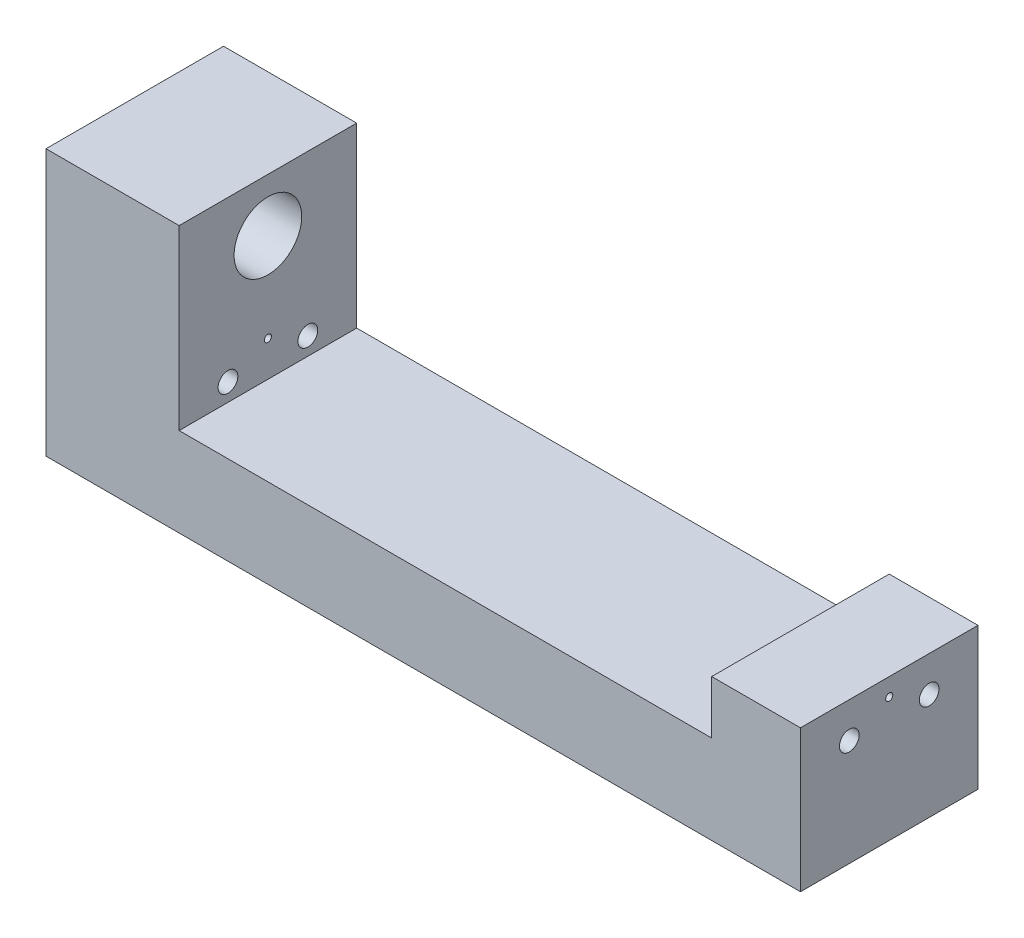
ISO-10303-21;
HEADER;
FILE_DESCRIPTION(('STEP AP214'),'2;1');
FILE_NAME('part.step','',(''),(''),'','','');
FILE_SCHEMA(('AUTOMOTIVE_DESIGN { 1 0 10303 214 1 1 1 1 }'));
ENDSEC;
DATA;
#1=APPLICATION_CONTEXT('core data for automotive mechanical design processes');
#2=APPLICATION_PROTOCOL_DEFINITION('international standard','automotive_design',2000,#1);
#3=PRODUCT_CONTEXT('',#1,'mechanical');
#4=PRODUCT('Part','Part','',(#3));
#5=PRODUCT_RELATED_PRODUCT_CATEGORY('part','',(#4));
#6=PRODUCT_DEFINITION_FORMATION('','',#4);
#7=PRODUCT_DEFINITION_CONTEXT('part definition',#1,'design');
#8=PRODUCT_DEFINITION('design','',#6,#7);
#9=PRODUCT_DEFINITION_SHAPE('','',#8);
#10=(LENGTH_UNIT() NAMED_UNIT(*) SI_UNIT(.MILLI.,.METRE.));
#11=(NAMED_UNIT(*) PLANE_ANGLE_UNIT() SI_UNIT($,.RADIAN.));
#12=(NAMED_UNIT(*) SI_UNIT($,.STERADIAN.) SOLID_ANGLE_UNIT());
#13=UNCERTAINTY_MEASURE_WITH_UNIT(LENGTH_MEASURE(1.E-05),#10,'distance_accuracy_value','');
#14=(GEOMETRIC_REPRESENTATION_CONTEXT(3) GLOBAL_UNCERTAINTY_ASSIGNED_CONTEXT((#13)) GLOBAL_UNIT_ASSIGNED_CONTEXT((#10,
#11,#12)) REPRESENTATION_CONTEXT('',''));
#15=CARTESIAN_POINT('',(0.,0.,0.));
#16=DIRECTION('',(0.,0.,1.));
#17=DIRECTION('',(1.,0.,0.));
#18=AXIS2_PLACEMENT_3D('',#15,#16,#17);
#19=CARTESIAN_POINT('',(0.,100.,0.));
#20=DIRECTION('',(0.,-1.,0.));
#21=DIRECTION('',(0.,0.,-1.));
#22=AXIS2_PLACEMENT_3D('',#19,#20,#21);
#23=PLANE('',#22);
#24=DIRECTION('',(0.,0.,1.));
#25=VECTOR('',#24,1.);
#26=CARTESIAN_POINT('',(750.,100.,0.));
#27=LINE('',#26,#25);
#28=CARTESIAN_POINT('',(750.,100.,-200.));
#29=VERTEX_POINT('',#28);
#30=CARTESIAN_POINT('',(750.,100.,0.));
#31=VERTEX_POINT('',#30);
#32=EDGE_CURVE('E124',#29,#31,#27,.T.);
#33=ORIENTED_EDGE('',*,*,#32,.F.);
#34=DIRECTION('',(-1.,0.,0.));
#35=VECTOR('',#34,1.);
#36=CARTESIAN_POINT('',(0.,100.,-200.));
#37=LINE('',#36,#35);
#38=CARTESIAN_POINT('',(150.,100.,-200.));
#39=VERTEX_POINT('',#38);
#40=EDGE_CURVE('E156',#29,#39,#37,.T.);
#41=ORIENTED_EDGE('',*,*,#40,.T.);
#42=DIRECTION('',(0.,0.,-1.));
#43=VECTOR('',#42,1.);
#44=CARTESIAN_POINT('',(150.,100.,0.));
#45=LINE('',#44,#43);
#46=CARTESIAN_POINT('',(150.,100.,0.));
#47=VERTEX_POINT('',#46);
#48=EDGE_CURVE('E55',#47,#39,#45,.T.);
#49=ORIENTED_EDGE('',*,*,#48,.F.);
#50=DIRECTION('',(1.,0.,0.));
#51=VECTOR('',#50,1.);
#52=CARTESIAN_POINT('',(0.,100.,0.));
#53=LINE('',#52,#51);
#54=EDGE_CURVE('E50',#47,#31,#53,.T.);
#55=ORIENTED_EDGE('',*,*,#54,.T.);
#56=EDGE_LOOP('',(#33,#41,#49,#55));
#57=FACE_BOUND('',#56,.T.);
#58=ADVANCED_FACE('F33',(#57),#23,.F.);
#59=CARTESIAN_POINT('',(0.,100.,0.));
#60=DIRECTION('',(1.,0.,0.));
#61=DIRECTION('',(0.,0.,-1.));
#62=AXIS2_PLACEMENT_3D('',#59,#60,#61);
#63=PLANE('',#62);
#64=CARTESIAN_POINT('',(0.,240.,-100.));
#65=DIRECTION('',(1.,0.,0.));
#66=DIRECTION('',(0.,0.,-1.));
#67=AXIS2_PLACEMENT_3D('',#64,#65,#66);
#68=CIRCLE('',#67,38.1);
#69=CARTESIAN_POINT('',(0.,240.,-138.1));
#70=VERTEX_POINT('',#69);
#71=EDGE_CURVE('E126',#70,#70,#68,.T.);
#72=ORIENTED_EDGE('',*,*,#71,.T.);
#73=EDGE_LOOP('',(#72));
#74=FACE_BOUND('',#73,.T.);
#75=CARTESIAN_POINT('',(0.,120.,-145.));
#76=DIRECTION('',(1.,0.,0.));
#77=DIRECTION('',(0.,0.,-1.));
#78=AXIS2_PLACEMENT_3D('',#75,#76,#77);
#79=CIRCLE('',#78,11.11);
#80=CARTESIAN_POINT('',(0.,120.,-156.11));
#81=VERTEX_POINT('',#80);
#82=EDGE_CURVE('E184',#81,#81,#79,.T.);
#83=ORIENTED_EDGE('',*,*,#82,.T.);
#84=EDGE_LOOP('',(#83));
#85=FACE_BOUND('',#84,.T.);
#86=CARTESIAN_POINT('',(0.,120.,-55.));
#87=DIRECTION('',(1.,0.,0.));
#88=DIRECTION('',(0.,0.,-1.));
#89=AXIS2_PLACEMENT_3D('',#86,#87,#88);
#90=CIRCLE('',#89,11.11);
#91=CARTESIAN_POINT('',(0.,120.,-66.11));
#92=VERTEX_POINT('',#91);
#93=EDGE_CURVE('E180',#92,#92,#90,.T.);
#94=ORIENTED_EDGE('',*,*,#93,.T.);
#95=EDGE_LOOP('',(#94));
#96=FACE_BOUND('',#95,.T.);
#97=CARTESIAN_POINT('',(0.,140.,-100.));
#98=DIRECTION('',(1.,0.,0.));
#99=DIRECTION('',(0.,0.,-1.));
#100=AXIS2_PLACEMENT_3D('',#97,#98,#99);
#101=CIRCLE('',#100,4.00000000000001);
#102=CARTESIAN_POINT('',(0.,140.,-104.));
#103=VERTEX_POINT('',#102);
#104=EDGE_CURVE('E176',#103,#103,#101,.T.);
#105=ORIENTED_EDGE('',*,*,#104,.T.);
#106=EDGE_LOOP('',(#105));
#107=FACE_BOUND('',#106,.T.);
#108=DIRECTION('',(0.,0.,1.));
#109=VECTOR('',#108,1.);
#110=CARTESIAN_POINT('',(0.,0.,0.));
#111=LINE('',#110,#109);
#112=CARTESIAN_POINT('',(0.,0.,-200.));
#113=VERTEX_POINT('',#112);
#114=CARTESIAN_POINT('',(0.,0.,0.));
#115=VERTEX_POINT('',#114);
#116=EDGE_CURVE('E154',#113,#115,#111,.T.);
#117=ORIENTED_EDGE('',*,*,#116,.T.);
#118=DIRECTION('',(0.,-1.,0.));
#119=VECTOR('',#118,1.);
#120=CARTESIAN_POINT('',(0.,100.,0.));
#121=LINE('',#120,#119);
#122=CARTESIAN_POINT('',(0.,300.,0.));
#123=VERTEX_POINT('',#122);
#124=EDGE_CURVE('E11',#123,#115,#121,.T.);
#125=ORIENTED_EDGE('',*,*,#124,.F.);
#126=DIRECTION('',(0.,0.,1.));
#127=VECTOR('',#126,1.);
#128=CARTESIAN_POINT('',(0.,300.,0.));
#129=LINE('',#128,#127);
#130=CARTESIAN_POINT('',(0.,300.,-200.));
#131=VERTEX_POINT('',#130);
#132=EDGE_CURVE('E137',#131,#123,#129,.T.);
#133=ORIENTED_EDGE('',*,*,#132,.F.);
#134=DIRECTION('',(0.,-1.,0.));
#135=VECTOR('',#134,1.);
#136=CARTESIAN_POINT('',(0.,100.,-200.));
#137=LINE('',#136,#135);
#138=EDGE_CURVE('E109',#131,#113,#137,.T.);
#139=ORIENTED_EDGE('',*,*,#138,.T.);
#140=EDGE_LOOP('',(#117,#125,#133,#139));
#141=FACE_BOUND('',#140,.T.);
#142=ADVANCED_FACE('F35',(#74,#85,#96,#107,#141),#63,.F.);
#143=CARTESIAN_POINT('',(0.,100.,0.));
#144=DIRECTION('',(0.,0.,-1.));
#145=DIRECTION('',(-1.,0.,0.));
#146=AXIS2_PLACEMENT_3D('',#143,#144,#145);
#147=PLANE('',#146);
#148=DIRECTION('',(1.,0.,0.));
#149=VECTOR('',#148,1.);
#150=CARTESIAN_POINT('',(0.,0.,0.));
#151=LINE('',#150,#149);
#152=CARTESIAN_POINT('',(850.,0.,0.));
#153=VERTEX_POINT('',#152);
#154=EDGE_CURVE('E161',#115,#153,#151,.T.);
#155=ORIENTED_EDGE('',*,*,#154,.T.);
#156=DIRECTION('',(0.,-1.,0.));
#157=VECTOR('',#156,1.);
#158=CARTESIAN_POINT('',(850.,100.,0.));
#159=LINE('',#158,#157);
#160=CARTESIAN_POINT('',(850.,160.,0.));
#161=VERTEX_POINT('',#160);
#162=EDGE_CURVE('E42',#161,#153,#159,.T.);
#163=ORIENTED_EDGE('',*,*,#162,.F.);
#164=DIRECTION('',(1.,0.,0.));
#165=VECTOR('',#164,1.);
#166=CARTESIAN_POINT('',(850.,160.,0.));
#167=LINE('',#166,#165);
#168=CARTESIAN_POINT('',(750.,160.,0.));
#169=VERTEX_POINT('',#168);
#170=EDGE_CURVE('E123',#169,#161,#167,.T.);
#171=ORIENTED_EDGE('',*,*,#170,.F.);
#172=DIRECTION('',(0.,-1.,0.));
#173=VECTOR('',#172,1.);
#174=CARTESIAN_POINT('',(750.,160.,0.));
#175=LINE('',#174,#173);
#176=EDGE_CURVE('E132',#169,#31,#175,.T.);
#177=ORIENTED_EDGE('',*,*,#176,.T.);
#178=ORIENTED_EDGE('',*,*,#54,.F.);
#179=DIRECTION('',(0.,-1.,0.));
#180=VECTOR('',#179,1.);
#181=CARTESIAN_POINT('',(150.,300.,0.));
#182=LINE('',#181,#180);
#183=CARTESIAN_POINT('',(150.,300.,0.));
#184=VERTEX_POINT('',#183);
#185=EDGE_CURVE('E151',#184,#47,#182,.T.);
#186=ORIENTED_EDGE('',*,*,#185,.F.);
#187=DIRECTION('',(1.,0.,0.));
#188=VECTOR('',#187,1.);
#189=CARTESIAN_POINT('',(0.,300.,0.));
#190=LINE('',#189,#188);
#191=EDGE_CURVE('E140',#123,#184,#190,.T.);
#192=ORIENTED_EDGE('',*,*,#191,.F.);
#193=ORIENTED_EDGE('',*,*,#124,.T.);
#194=EDGE_LOOP('',(#155,#163,#171,#177,#178,#186,#192,#193));
#195=FACE_BOUND('',#194,.T.);
#196=ADVANCED_FACE('F220',(#195),#147,.F.);
#197=CARTESIAN_POINT('',(850.,100.,0.));
#198=DIRECTION('',(-1.,0.,0.));
#199=DIRECTION('',(0.,0.,1.));
#200=AXIS2_PLACEMENT_3D('',#197,#198,#199);
#201=PLANE('',#200);
#202=CARTESIAN_POINT('',(850.,120.,-145.));
#203=DIRECTION('',(-1.,0.,0.));
#204=DIRECTION('',(0.,0.,1.));
#205=AXIS2_PLACEMENT_3D('',#202,#203,#204);
#206=CIRCLE('',#205,11.11);
#207=CARTESIAN_POINT('',(850.,120.,-133.89));
#208=VERTEX_POINT('',#207);
#209=EDGE_CURVE('E172',#208,#208,#206,.T.);
#210=ORIENTED_EDGE('',*,*,#209,.T.);
#211=EDGE_LOOP('',(#210));
#212=FACE_BOUND('',#211,.T.);
#213=CARTESIAN_POINT('',(850.,120.,-55.));
#214=DIRECTION('',(-1.,0.,0.));
#215=DIRECTION('',(0.,0.,-1.));
#216=AXIS2_PLACEMENT_3D('',#213,#214,#215);
#217=CIRCLE('',#216,11.11);
#218=CARTESIAN_POINT('',(850.,120.,-66.11));
#219=VERTEX_POINT('',#218);
#220=EDGE_CURVE('E283',#219,#219,#217,.T.);
#221=ORIENTED_EDGE('',*,*,#220,.T.);
#222=EDGE_LOOP('',(#221));
#223=FACE_BOUND('',#222,.T.);
#224=CARTESIAN_POINT('',(850.,140.,-100.));
#225=DIRECTION('',(-1.,0.,0.));
#226=DIRECTION('',(0.,0.,1.));
#227=AXIS2_PLACEMENT_3D('',#224,#225,#226);
#228=CIRCLE('',#227,4.00000000000001);
#229=CARTESIAN_POINT('',(850.,140.,-96.));
#230=VERTEX_POINT('',#229);
#231=EDGE_CURVE('E289',#230,#230,#228,.T.);
#232=ORIENTED_EDGE('',*,*,#231,.T.);
#233=EDGE_LOOP('',(#232));
#234=FACE_BOUND('',#233,.T.);
#235=DIRECTION('',(0.,0.,-1.));
#236=VECTOR('',#235,1.);
#237=CARTESIAN_POINT('',(850.,0.,0.));
#238=LINE('',#237,#236);
#239=CARTESIAN_POINT('',(850.,0.,-200.));
#240=VERTEX_POINT('',#239);
#241=EDGE_CURVE('E106',#153,#240,#238,.T.);
#242=ORIENTED_EDGE('',*,*,#241,.T.);
#243=DIRECTION('',(0.,-1.,0.));
#244=VECTOR('',#243,1.);
#245=CARTESIAN_POINT('',(850.,100.,-200.));
#246=LINE('',#245,#244);
#247=CARTESIAN_POINT('',(850.,160.,-200.));
#248=VERTEX_POINT('',#247);
#249=EDGE_CURVE('E99',#248,#240,#246,.T.);
#250=ORIENTED_EDGE('',*,*,#249,.F.);
#251=DIRECTION('',(0.,0.,-1.));
#252=VECTOR('',#251,1.);
#253=CARTESIAN_POINT('',(850.,160.,0.));
#254=LINE('',#253,#252);
#255=EDGE_CURVE('E104',#161,#248,#254,.T.);
#256=ORIENTED_EDGE('',*,*,#255,.F.);
#257=ORIENTED_EDGE('',*,*,#162,.T.);
#258=EDGE_LOOP('',(#242,#250,#256,#257));
#259=FACE_BOUND('',#258,.T.);
#260=ADVANCED_FACE('F101',(#212,#223,#234,#259),#201,.F.);
#261=CARTESIAN_POINT('',(0.,100.,-200.));
#262=DIRECTION('',(0.,0.,1.));
#263=DIRECTION('',(1.,0.,0.));
#264=AXIS2_PLACEMENT_3D('',#261,#262,#263);
#265=PLANE('',#264);
#266=DIRECTION('',(-1.,0.,0.));
#267=VECTOR('',#266,1.);
#268=CARTESIAN_POINT('',(0.,0.,-200.));
#269=LINE('',#268,#267);
#270=EDGE_CURVE('E157',#240,#113,#269,.T.);
#271=ORIENTED_EDGE('',*,*,#270,.T.);
#272=ORIENTED_EDGE('',*,*,#138,.F.);
#273=DIRECTION('',(-1.,0.,0.));
#274=VECTOR('',#273,1.);
#275=CARTESIAN_POINT('',(0.,300.,-200.));
#276=LINE('',#275,#274);
#277=CARTESIAN_POINT('',(150.,300.,-200.));
#278=VERTEX_POINT('',#277);
#279=EDGE_CURVE('E144',#278,#131,#276,.T.);
#280=ORIENTED_EDGE('',*,*,#279,.F.);
#281=DIRECTION('',(0.,-1.,0.));
#282=VECTOR('',#281,1.);
#283=CARTESIAN_POINT('',(150.,300.,-200.));
#284=LINE('',#283,#282);
#285=EDGE_CURVE('E147',#278,#39,#284,.T.);
#286=ORIENTED_EDGE('',*,*,#285,.T.);
#287=ORIENTED_EDGE('',*,*,#40,.F.);
#288=DIRECTION('',(0.,-1.,0.));
#289=VECTOR('',#288,1.);
#290=CARTESIAN_POINT('',(750.,160.,-200.));
#291=LINE('',#290,#289);
#292=CARTESIAN_POINT('',(750.,160.,-200.));
#293=VERTEX_POINT('',#292);
#294=EDGE_CURVE('E115',#293,#29,#291,.T.);
#295=ORIENTED_EDGE('',*,*,#294,.F.);
#296=DIRECTION('',(-1.,0.,0.));
#297=VECTOR('',#296,1.);
#298=CARTESIAN_POINT('',(850.,160.,-200.));
#299=LINE('',#298,#297);
#300=EDGE_CURVE('E112',#248,#293,#299,.T.);
#301=ORIENTED_EDGE('',*,*,#300,.F.);
#302=ORIENTED_EDGE('',*,*,#249,.T.);
#303=EDGE_LOOP('',(#271,#272,#280,#286,#287,#295,#301,#302));
#304=FACE_BOUND('',#303,.T.);
#305=ADVANCED_FACE('F113',(#304),#265,.F.);
#306=CARTESIAN_POINT('',(0.,0.,0.));
#307=DIRECTION('',(0.,-1.,0.));
#308=DIRECTION('',(0.,0.,-1.));
#309=AXIS2_PLACEMENT_3D('',#306,#307,#308);
#310=PLANE('',#309);
#311=ORIENTED_EDGE('',*,*,#116,.F.);
#312=ORIENTED_EDGE('',*,*,#270,.F.);
#313=ORIENTED_EDGE('',*,*,#241,.F.);
#314=ORIENTED_EDGE('',*,*,#154,.F.);
#315=EDGE_LOOP('',(#311,#312,#313,#314));
#316=FACE_BOUND('',#315,.T.);
#317=ADVANCED_FACE('F225',(#316),#310,.T.);
#318=CARTESIAN_POINT('',(150.,300.,0.));
#319=DIRECTION('',(-1.,0.,0.));
#320=DIRECTION('',(0.,0.,1.));
#321=AXIS2_PLACEMENT_3D('',#318,#319,#320);
#322=PLANE('',#321);
#323=CARTESIAN_POINT('',(150.,240.,-100.));
#324=DIRECTION('',(-1.,0.,0.));
#325=DIRECTION('',(0.,0.,1.));
#326=AXIS2_PLACEMENT_3D('',#323,#324,#325);
#327=CIRCLE('',#326,38.1);
#328=CARTESIAN_POINT('',(150.,240.,-61.9));
#329=VERTEX_POINT('',#328);
#330=EDGE_CURVE('E37',#329,#329,#327,.T.);
#331=ORIENTED_EDGE('',*,*,#330,.T.);
#332=EDGE_LOOP('',(#331));
#333=FACE_BOUND('',#332,.T.);
#334=CARTESIAN_POINT('',(150.,120.,-145.));
#335=DIRECTION('',(-1.,0.,0.));
#336=DIRECTION('',(0.,0.,1.));
#337=AXIS2_PLACEMENT_3D('',#334,#335,#336);
#338=CIRCLE('',#337,11.11);
#339=CARTESIAN_POINT('',(150.,120.,-133.89));
#340=VERTEX_POINT('',#339);
#341=EDGE_CURVE('E179',#340,#340,#338,.T.);
#342=ORIENTED_EDGE('',*,*,#341,.T.);
#343=EDGE_LOOP('',(#342));
#344=FACE_BOUND('',#343,.T.);
#345=CARTESIAN_POINT('',(150.,120.,-55.));
#346=DIRECTION('',(-1.,0.,0.));
#347=DIRECTION('',(0.,0.,1.));
#348=AXIS2_PLACEMENT_3D('',#345,#346,#347);
#349=CIRCLE('',#348,11.11);
#350=CARTESIAN_POINT('',(150.,120.,-43.89));
#351=VERTEX_POINT('',#350);
#352=EDGE_CURVE('E175',#351,#351,#349,.T.);
#353=ORIENTED_EDGE('',*,*,#352,.T.);
#354=EDGE_LOOP('',(#353));
#355=FACE_BOUND('',#354,.T.);
#356=CARTESIAN_POINT('',(150.,140.,-100.));
#357=DIRECTION('',(-1.,0.,0.));
#358=DIRECTION('',(0.,0.,1.));
#359=AXIS2_PLACEMENT_3D('',#356,#357,#358);
#360=CIRCLE('',#359,4.00000000000001);
#361=CARTESIAN_POINT('',(150.,140.,-96.));
#362=VERTEX_POINT('',#361);
#363=EDGE_CURVE('E171',#362,#362,#360,.T.);
#364=ORIENTED_EDGE('',*,*,#363,.T.);
#365=EDGE_LOOP('',(#364));
#366=FACE_BOUND('',#365,.T.);
#367=ORIENTED_EDGE('',*,*,#48,.T.);
#368=ORIENTED_EDGE('',*,*,#285,.F.);
#369=DIRECTION('',(0.,0.,-1.));
#370=VECTOR('',#369,1.);
#371=CARTESIAN_POINT('',(150.,300.,0.));
#372=LINE('',#371,#370);
#373=EDGE_CURVE('E142',#184,#278,#372,.T.);
#374=ORIENTED_EDGE('',*,*,#373,.F.);
#375=ORIENTED_EDGE('',*,*,#185,.T.);
#376=EDGE_LOOP('',(#367,#368,#374,#375));
#377=FACE_BOUND('',#376,.T.);
#378=ADVANCED_FACE('F223',(#333,#344,#355,#366,#377),#322,.F.);
#379=CARTESIAN_POINT('',(0.,300.,0.));
#380=DIRECTION('',(0.,-1.,0.));
#381=DIRECTION('',(0.,0.,-1.));
#382=AXIS2_PLACEMENT_3D('',#379,#380,#381);
#383=PLANE('',#382);
#384=ORIENTED_EDGE('',*,*,#132,.T.);
#385=ORIENTED_EDGE('',*,*,#191,.T.);
#386=ORIENTED_EDGE('',*,*,#373,.T.);
#387=ORIENTED_EDGE('',*,*,#279,.T.);
#388=EDGE_LOOP('',(#384,#385,#386,#387));
#389=FACE_BOUND('',#388,.T.);
#390=ADVANCED_FACE('F243',(#389),#383,.F.);
#391=CARTESIAN_POINT('',(750.,160.,0.));
#392=DIRECTION('',(1.,0.,0.));
#393=DIRECTION('',(0.,0.,-1.));
#394=AXIS2_PLACEMENT_3D('',#391,#392,#393);
#395=PLANE('',#394);
#396=CARTESIAN_POINT('',(750.,120.,-145.));
#397=DIRECTION('',(1.,0.,0.));
#398=DIRECTION('',(0.,0.,-1.));
#399=AXIS2_PLACEMENT_3D('',#396,#397,#398);
#400=CIRCLE('',#399,11.11);
#401=CARTESIAN_POINT('',(750.,120.,-156.11));
#402=VERTEX_POINT('',#401);
#403=EDGE_CURVE('E177',#402,#402,#400,.T.);
#404=ORIENTED_EDGE('',*,*,#403,.T.);
#405=EDGE_LOOP('',(#404));
#406=FACE_BOUND('',#405,.T.);
#407=CARTESIAN_POINT('',(750.,120.,-55.));
#408=DIRECTION('',(1.,0.,0.));
#409=DIRECTION('',(0.,0.,-1.));
#410=AXIS2_PLACEMENT_3D('',#407,#408,#409);
#411=CIRCLE('',#410,11.11);
#412=CARTESIAN_POINT('',(750.,120.,-66.11));
#413=VERTEX_POINT('',#412);
#414=EDGE_CURVE('E173',#413,#413,#411,.T.);
#415=ORIENTED_EDGE('',*,*,#414,.T.);
#416=EDGE_LOOP('',(#415));
#417=FACE_BOUND('',#416,.T.);
#418=CARTESIAN_POINT('',(750.,140.,-100.));
#419=DIRECTION('',(1.,0.,0.));
#420=DIRECTION('',(0.,0.,-1.));
#421=AXIS2_PLACEMENT_3D('',#418,#419,#420);
#422=CIRCLE('',#421,4.00000000000001);
#423=CARTESIAN_POINT('',(750.,140.,-104.));
#424=VERTEX_POINT('',#423);
#425=EDGE_CURVE('E168',#424,#424,#422,.T.);
#426=ORIENTED_EDGE('',*,*,#425,.T.);
#427=EDGE_LOOP('',(#426));
#428=FACE_BOUND('',#427,.T.);
#429=ORIENTED_EDGE('',*,*,#32,.T.);
#430=ORIENTED_EDGE('',*,*,#176,.F.);
#431=DIRECTION('',(0.,0.,1.));
#432=VECTOR('',#431,1.);
#433=CARTESIAN_POINT('',(750.,160.,0.));
#434=LINE('',#433,#432);
#435=EDGE_CURVE('E118',#293,#169,#434,.T.);
#436=ORIENTED_EDGE('',*,*,#435,.F.);
#437=ORIENTED_EDGE('',*,*,#294,.T.);
#438=EDGE_LOOP('',(#429,#430,#436,#437));
#439=FACE_BOUND('',#438,.T.);
#440=ADVANCED_FACE('F250',(#406,#417,#428,#439),#395,.F.);
#441=CARTESIAN_POINT('',(0.,160.,0.));
#442=DIRECTION('',(0.,1.,0.));
#443=DIRECTION('',(0.,0.,1.));
#444=AXIS2_PLACEMENT_3D('',#441,#442,#443);
#445=PLANE('',#444);
#446=ORIENTED_EDGE('',*,*,#255,.T.);
#447=ORIENTED_EDGE('',*,*,#300,.T.);
#448=ORIENTED_EDGE('',*,*,#435,.T.);
#449=ORIENTED_EDGE('',*,*,#170,.T.);
#450=EDGE_LOOP('',(#446,#447,#448,#449));
#451=FACE_BOUND('',#450,.T.);
#452=ADVANCED_FACE('F121',(#451),#445,.T.);
#453=CARTESIAN_POINT('',(850.,140.,-100.));
#454=DIRECTION('',(-1.,0.,0.));
#455=DIRECTION('',(0.,0.,1.));
#456=AXIS2_PLACEMENT_3D('',#453,#454,#455);
#457=CYLINDRICAL_SURFACE('',#456,4.00000000000001);
#458=ORIENTED_EDGE('',*,*,#231,.F.);
#459=EDGE_LOOP('',(#458));
#460=FACE_BOUND('',#459,.T.);
#461=ORIENTED_EDGE('',*,*,#425,.F.);
#462=EDGE_LOOP('',(#461));
#463=FACE_BOUND('',#462,.T.);
#464=ADVANCED_FACE('F257',(#460,#463),#457,.F.);
#465=CARTESIAN_POINT('',(850.,120.,-55.));
#466=DIRECTION('',(-1.,0.,0.));
#467=DIRECTION('',(0.,0.,1.));
#468=AXIS2_PLACEMENT_3D('',#465,#466,#467);
#469=CYLINDRICAL_SURFACE('',#468,11.11);
#470=ORIENTED_EDGE('',*,*,#220,.F.);
#471=EDGE_LOOP('',(#470));
#472=FACE_BOUND('',#471,.T.);
#473=ORIENTED_EDGE('',*,*,#414,.F.);
#474=EDGE_LOOP('',(#473));
#475=FACE_BOUND('',#474,.T.);
#476=ADVANCED_FACE('F267',(#472,#475),#469,.F.);
#477=CARTESIAN_POINT('',(850.,120.,-145.));
#478=DIRECTION('',(-1.,0.,0.));
#479=DIRECTION('',(0.,0.,1.));
#480=AXIS2_PLACEMENT_3D('',#477,#478,#479);
#481=CYLINDRICAL_SURFACE('',#480,11.11);
#482=ORIENTED_EDGE('',*,*,#209,.F.);
#483=EDGE_LOOP('',(#482));
#484=FACE_BOUND('',#483,.T.);
#485=ORIENTED_EDGE('',*,*,#403,.F.);
#486=EDGE_LOOP('',(#485));
#487=FACE_BOUND('',#486,.T.);
#488=ADVANCED_FACE('F214',(#484,#487),#481,.F.);
#489=ORIENTED_EDGE('',*,*,#363,.F.);
#490=EDGE_LOOP('',(#489));
#491=FACE_BOUND('',#490,.T.);
#492=ORIENTED_EDGE('',*,*,#104,.F.);
#493=EDGE_LOOP('',(#492));
#494=FACE_BOUND('',#493,.T.);
#495=ADVANCED_FACE('F261',(#491,#494),#457,.F.);
#496=ORIENTED_EDGE('',*,*,#352,.F.);
#497=EDGE_LOOP('',(#496));
#498=FACE_BOUND('',#497,.T.);
#499=ORIENTED_EDGE('',*,*,#93,.F.);
#500=EDGE_LOOP('',(#499));
#501=FACE_BOUND('',#500,.T.);
#502=ADVANCED_FACE('F211',(#498,#501),#469,.F.);
#503=ORIENTED_EDGE('',*,*,#341,.F.);
#504=EDGE_LOOP('',(#503));
#505=FACE_BOUND('',#504,.T.);
#506=ORIENTED_EDGE('',*,*,#82,.F.);
#507=EDGE_LOOP('',(#506));
#508=FACE_BOUND('',#507,.T.);
#509=ADVANCED_FACE('F205',(#505,#508),#481,.F.);
#510=CARTESIAN_POINT('',(850.,240.,-100.));
#511=DIRECTION('',(-1.,0.,0.));
#512=DIRECTION('',(0.,0.,1.));
#513=AXIS2_PLACEMENT_3D('',#510,#511,#512);
#514=CYLINDRICAL_SURFACE('',#513,38.1);
#515=ORIENTED_EDGE('',*,*,#330,.F.);
#516=EDGE_LOOP('',(#515));
#517=FACE_BOUND('',#516,.T.);
#518=ORIENTED_EDGE('',*,*,#71,.F.);
#519=EDGE_LOOP('',(#518));
#520=FACE_BOUND('',#519,.T.);
#521=ADVANCED_FACE('F203',(#517,#520),#514,.F.);
#522=CLOSED_SHELL('',(#58,#142,#196,#260,#305,#317,#378,#390,#440,#452,#464,#476,#488,#495,#502,
#509,#521));
#523=MANIFOLD_SOLID_BREP('B2',#522);
#524=ADVANCED_BREP_SHAPE_REPRESENTATION('',(#18,#523),#14);
#525=SHAPE_DEFINITION_REPRESENTATION(#9,#524);
ENDSEC;
END-ISO-10303-21;
